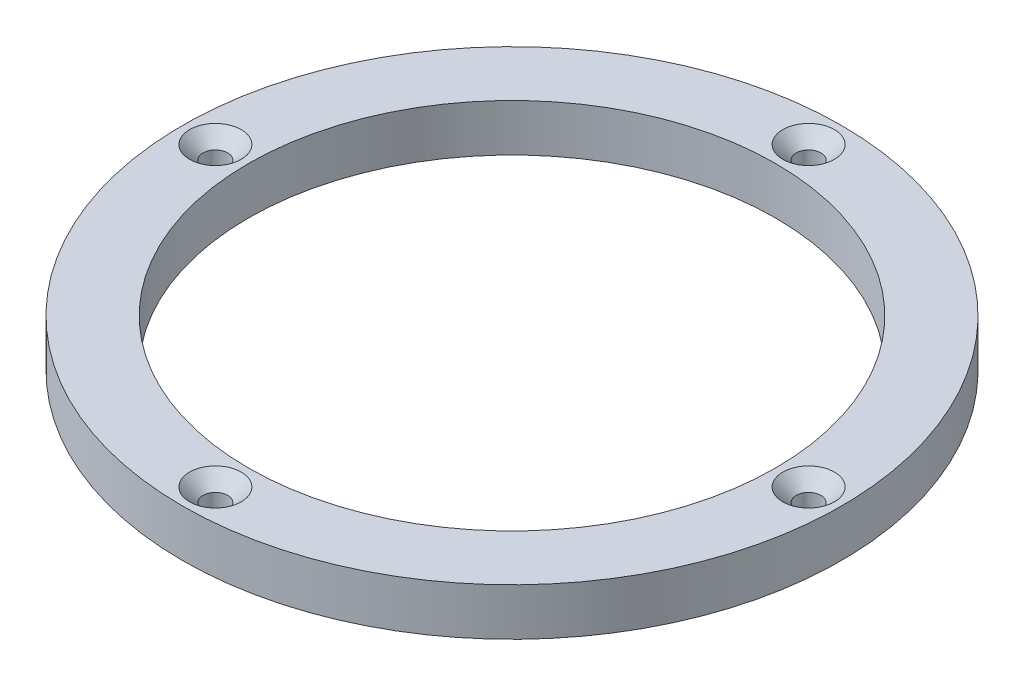
ISO-10303-21;
HEADER;
FILE_DESCRIPTION(('STEP AP214'),'2;1');
FILE_NAME('part.step','',(''),(''),'','','');
FILE_SCHEMA(('AUTOMOTIVE_DESIGN { 1 0 10303 214 1 1 1 1 }'));
ENDSEC;
DATA;
#1=APPLICATION_CONTEXT('core data for automotive mechanical design processes');
#2=APPLICATION_PROTOCOL_DEFINITION('international standard','automotive_design',2000,#1);
#3=PRODUCT_CONTEXT('',#1,'mechanical');
#4=PRODUCT('Part','Part','',(#3));
#5=PRODUCT_RELATED_PRODUCT_CATEGORY('part','',(#4));
#6=PRODUCT_DEFINITION_FORMATION('','',#4);
#7=PRODUCT_DEFINITION_CONTEXT('part definition',#1,'design');
#8=PRODUCT_DEFINITION('design','',#6,#7);
#9=PRODUCT_DEFINITION_SHAPE('','',#8);
#10=(LENGTH_UNIT() NAMED_UNIT(*) SI_UNIT(.MILLI.,.METRE.));
#11=(NAMED_UNIT(*) PLANE_ANGLE_UNIT() SI_UNIT($,.RADIAN.));
#12=(NAMED_UNIT(*) SI_UNIT($,.STERADIAN.) SOLID_ANGLE_UNIT());
#13=UNCERTAINTY_MEASURE_WITH_UNIT(LENGTH_MEASURE(1.E-05),#10,'distance_accuracy_value','');
#14=(GEOMETRIC_REPRESENTATION_CONTEXT(3) GLOBAL_UNCERTAINTY_ASSIGNED_CONTEXT((#13)) GLOBAL_UNIT_ASSIGNED_CONTEXT((#10,
#11,#12)) REPRESENTATION_CONTEXT('',''));
#15=CARTESIAN_POINT('',(0.,0.,0.));
#16=DIRECTION('',(0.,0.,1.));
#17=DIRECTION('',(1.,0.,0.));
#18=AXIS2_PLACEMENT_3D('',#15,#16,#17);
#19=CARTESIAN_POINT('',(0.,8.6,0.));
#20=DIRECTION('',(0.,1.,0.));
#21=DIRECTION('',(0.,0.,1.));
#22=AXIS2_PLACEMENT_3D('',#19,#20,#21);
#23=PLANE('',#22);
#24=CARTESIAN_POINT('',(0.,8.6,-54.));
#25=DIRECTION('',(0.,1.,0.));
#26=DIRECTION('',(0.,0.,1.));
#27=AXIS2_PLACEMENT_3D('',#24,#25,#26);
#28=CIRCLE('',#27,4.7);
#29=CARTESIAN_POINT('',(0.,8.6,-49.3));
#30=VERTEX_POINT('',#29);
#31=EDGE_CURVE('E86',#30,#30,#28,.T.);
#32=ORIENTED_EDGE('',*,*,#31,.F.);
#33=EDGE_LOOP('',(#32));
#34=FACE_BOUND('',#33,.T.);
#35=CARTESIAN_POINT('',(0.,8.6,54.));
#36=DIRECTION('',(0.,1.,0.));
#37=DIRECTION('',(0.,0.,1.));
#38=AXIS2_PLACEMENT_3D('',#35,#36,#37);
#39=CIRCLE('',#38,4.7);
#40=CARTESIAN_POINT('',(0.,8.6,58.7));
#41=VERTEX_POINT('',#40);
#42=EDGE_CURVE('E76',#41,#41,#39,.T.);
#43=ORIENTED_EDGE('',*,*,#42,.F.);
#44=EDGE_LOOP('',(#43));
#45=FACE_BOUND('',#44,.T.);
#46=CARTESIAN_POINT('',(-54.,8.6,0.));
#47=DIRECTION('',(0.,1.,0.));
#48=DIRECTION('',(0.,0.,1.));
#49=AXIS2_PLACEMENT_3D('',#46,#47,#48);
#50=CIRCLE('',#49,4.7);
#51=CARTESIAN_POINT('',(-54.,8.6,4.7));
#52=VERTEX_POINT('',#51);
#53=EDGE_CURVE('E66',#52,#52,#50,.T.);
#54=ORIENTED_EDGE('',*,*,#53,.F.);
#55=EDGE_LOOP('',(#54));
#56=FACE_BOUND('',#55,.T.);
#57=CARTESIAN_POINT('',(54.,8.6,0.));
#58=DIRECTION('',(0.,1.,0.));
#59=DIRECTION('',(0.,0.,1.));
#60=AXIS2_PLACEMENT_3D('',#57,#58,#59);
#61=CIRCLE('',#60,4.7);
#62=CARTESIAN_POINT('',(54.,8.6,4.7));
#63=VERTEX_POINT('',#62);
#64=EDGE_CURVE('E62',#63,#63,#61,.T.);
#65=ORIENTED_EDGE('',*,*,#64,.F.);
#66=EDGE_LOOP('',(#65));
#67=FACE_BOUND('',#66,.T.);
#68=CARTESIAN_POINT('',(0.,8.6,0.));
#69=DIRECTION('',(0.,1.,0.));
#70=DIRECTION('',(0.,0.,1.));
#71=AXIS2_PLACEMENT_3D('',#68,#69,#70);
#72=CIRCLE('',#71,60.);
#73=CARTESIAN_POINT('',(0.,8.6,-60.));
#74=VERTEX_POINT('',#73);
#75=EDGE_CURVE('E10',#74,#74,#72,.T.);
#76=ORIENTED_EDGE('',*,*,#75,.T.);
#77=EDGE_LOOP('',(#76));
#78=FACE_BOUND('',#77,.T.);
#79=CARTESIAN_POINT('',(0.,8.6,0.));
#80=DIRECTION('',(0.,1.,0.));
#81=DIRECTION('',(0.,0.,1.));
#82=AXIS2_PLACEMENT_3D('',#79,#80,#81);
#83=CIRCLE('',#82,48.);
#84=CARTESIAN_POINT('',(0.,8.6,-48.));
#85=VERTEX_POINT('',#84);
#86=EDGE_CURVE('E48',#85,#85,#83,.T.);
#87=ORIENTED_EDGE('',*,*,#86,.F.);
#88=EDGE_LOOP('',(#87));
#89=FACE_BOUND('',#88,.T.);
#90=ADVANCED_FACE('F40',(#34,#45,#56,#67,#78,#89),#23,.T.);
#91=CARTESIAN_POINT('',(0.,0.,0.));
#92=DIRECTION('',(0.,1.,0.));
#93=DIRECTION('',(0.,0.,1.));
#94=AXIS2_PLACEMENT_3D('',#91,#92,#93);
#95=PLANE('',#94);
#96=CARTESIAN_POINT('',(0.,0.,-54.));
#97=DIRECTION('',(0.,1.,0.));
#98=DIRECTION('',(0.,0.,1.));
#99=AXIS2_PLACEMENT_3D('',#96,#97,#98);
#100=CIRCLE('',#99,2.25);
#101=CARTESIAN_POINT('',(0.,0.,-51.75));
#102=VERTEX_POINT('',#101);
#103=EDGE_CURVE('E84',#102,#102,#100,.T.);
#104=ORIENTED_EDGE('',*,*,#103,.T.);
#105=EDGE_LOOP('',(#104));
#106=FACE_BOUND('',#105,.T.);
#107=CARTESIAN_POINT('',(0.,0.,54.));
#108=DIRECTION('',(0.,1.,0.));
#109=DIRECTION('',(0.,0.,1.));
#110=AXIS2_PLACEMENT_3D('',#107,#108,#109);
#111=CIRCLE('',#110,2.25);
#112=CARTESIAN_POINT('',(0.,0.,56.25));
#113=VERTEX_POINT('',#112);
#114=EDGE_CURVE('E71',#113,#113,#111,.T.);
#115=ORIENTED_EDGE('',*,*,#114,.T.);
#116=EDGE_LOOP('',(#115));
#117=FACE_BOUND('',#116,.T.);
#118=CARTESIAN_POINT('',(-54.,0.,0.));
#119=DIRECTION('',(0.,1.,0.));
#120=DIRECTION('',(0.,0.,1.));
#121=AXIS2_PLACEMENT_3D('',#118,#119,#120);
#122=CIRCLE('',#121,2.25);
#123=CARTESIAN_POINT('',(-54.,0.,2.25));
#124=VERTEX_POINT('',#123);
#125=EDGE_CURVE('E61',#124,#124,#122,.T.);
#126=ORIENTED_EDGE('',*,*,#125,.T.);
#127=EDGE_LOOP('',(#126));
#128=FACE_BOUND('',#127,.T.);
#129=CARTESIAN_POINT('',(54.,0.,0.));
#130=DIRECTION('',(0.,1.,0.));
#131=DIRECTION('',(0.,0.,1.));
#132=AXIS2_PLACEMENT_3D('',#129,#130,#131);
#133=CIRCLE('',#132,2.25);
#134=CARTESIAN_POINT('',(54.,0.,2.25));
#135=VERTEX_POINT('',#134);
#136=EDGE_CURVE('E52',#135,#135,#133,.T.);
#137=ORIENTED_EDGE('',*,*,#136,.T.);
#138=EDGE_LOOP('',(#137));
#139=FACE_BOUND('',#138,.T.);
#140=CARTESIAN_POINT('',(0.,0.,0.));
#141=DIRECTION('',(0.,1.,0.));
#142=DIRECTION('',(0.,0.,1.));
#143=AXIS2_PLACEMENT_3D('',#140,#141,#142);
#144=CIRCLE('',#143,60.);
#145=CARTESIAN_POINT('',(0.,0.,-60.));
#146=VERTEX_POINT('',#145);
#147=EDGE_CURVE('E41',#146,#146,#144,.T.);
#148=ORIENTED_EDGE('',*,*,#147,.F.);
#149=EDGE_LOOP('',(#148));
#150=FACE_BOUND('',#149,.T.);
#151=CARTESIAN_POINT('',(0.,0.,0.));
#152=DIRECTION('',(0.,1.,0.));
#153=DIRECTION('',(0.,0.,1.));
#154=AXIS2_PLACEMENT_3D('',#151,#152,#153);
#155=CIRCLE('',#154,48.);
#156=CARTESIAN_POINT('',(0.,0.,-48.));
#157=VERTEX_POINT('',#156);
#158=EDGE_CURVE('E49',#157,#157,#155,.T.);
#159=ORIENTED_EDGE('',*,*,#158,.T.);
#160=EDGE_LOOP('',(#159));
#161=FACE_BOUND('',#160,.T.);
#162=ADVANCED_FACE('F96',(#106,#117,#128,#139,#150,#161),#95,.F.);
#163=CARTESIAN_POINT('',(0.,8.6,0.));
#164=DIRECTION('',(0.,-1.,0.));
#165=DIRECTION('',(0.,0.,-1.));
#166=AXIS2_PLACEMENT_3D('',#163,#164,#165);
#167=CYLINDRICAL_SURFACE('',#166,60.);
#168=CARTESIAN_POINT('',(0.,8.6,-60.));
#169=CARTESIAN_POINT('',(0.,8.51041666666666,-60.));
#170=CARTESIAN_POINT('',(0.,8.42083333333333,-60.));
#171=CARTESIAN_POINT('',(0.,8.24166666666667,-60.));
#172=CARTESIAN_POINT('',(0.,8.15208333333333,-60.));
#173=CARTESIAN_POINT('',(0.,7.97291666666667,-60.));
#174=CARTESIAN_POINT('',(0.,7.88333333333333,-60.));
#175=CARTESIAN_POINT('',(0.,7.70416666666667,-60.));
#176=CARTESIAN_POINT('',(0.,7.61458333333333,-60.));
#177=CARTESIAN_POINT('',(0.,7.43541666666667,-60.));
#178=CARTESIAN_POINT('',(0.,7.34583333333333,-60.));
#179=CARTESIAN_POINT('',(0.,7.16666666666667,-60.));
#180=CARTESIAN_POINT('',(0.,7.07708333333333,-60.));
#181=CARTESIAN_POINT('',(0.,6.89791666666667,-60.));
#182=CARTESIAN_POINT('',(0.,6.80833333333333,-60.));
#183=CARTESIAN_POINT('',(0.,6.62916666666667,-60.));
#184=CARTESIAN_POINT('',(0.,6.53958333333333,-60.));
#185=CARTESIAN_POINT('',(0.,6.36041666666667,-60.));
#186=CARTESIAN_POINT('',(0.,6.27083333333333,-60.));
#187=CARTESIAN_POINT('',(0.,6.09166666666667,-60.));
#188=CARTESIAN_POINT('',(0.,6.00208333333333,-60.));
#189=CARTESIAN_POINT('',(0.,5.82291666666667,-60.));
#190=CARTESIAN_POINT('',(0.,5.73333333333333,-60.));
#191=CARTESIAN_POINT('',(0.,5.55416666666667,-60.));
#192=CARTESIAN_POINT('',(0.,5.46458333333333,-60.));
#193=CARTESIAN_POINT('',(0.,5.28541666666667,-60.));
#194=CARTESIAN_POINT('',(0.,5.19583333333333,-60.));
#195=CARTESIAN_POINT('',(0.,5.01666666666667,-60.));
#196=CARTESIAN_POINT('',(0.,4.92708333333333,-60.));
#197=CARTESIAN_POINT('',(0.,4.74791666666667,-60.));
#198=CARTESIAN_POINT('',(0.,4.65833333333333,-60.));
#199=CARTESIAN_POINT('',(0.,4.47916666666667,-60.));
#200=CARTESIAN_POINT('',(0.,4.38958333333333,-60.));
#201=CARTESIAN_POINT('',(0.,4.21041666666667,-60.));
#202=CARTESIAN_POINT('',(0.,4.12083333333333,-60.));
#203=CARTESIAN_POINT('',(0.,3.94166666666667,-60.));
#204=CARTESIAN_POINT('',(0.,3.85208333333333,-60.));
#205=CARTESIAN_POINT('',(0.,3.67291666666667,-60.));
#206=CARTESIAN_POINT('',(0.,3.58333333333333,-60.));
#207=CARTESIAN_POINT('',(0.,3.40416666666667,-60.));
#208=CARTESIAN_POINT('',(0.,3.31458333333333,-60.));
#209=CARTESIAN_POINT('',(0.,3.13541666666667,-60.));
#210=CARTESIAN_POINT('',(0.,3.04583333333333,-60.));
#211=CARTESIAN_POINT('',(0.,2.86666666666667,-60.));
#212=CARTESIAN_POINT('',(0.,2.77708333333333,-60.));
#213=CARTESIAN_POINT('',(0.,2.59791666666667,-60.));
#214=CARTESIAN_POINT('',(0.,2.50833333333333,-60.));
#215=CARTESIAN_POINT('',(0.,2.32916666666667,-60.));
#216=CARTESIAN_POINT('',(0.,2.23958333333333,-60.));
#217=CARTESIAN_POINT('',(0.,2.06041666666667,-60.));
#218=CARTESIAN_POINT('',(0.,1.97083333333333,-60.));
#219=CARTESIAN_POINT('',(0.,1.79166666666667,-60.));
#220=CARTESIAN_POINT('',(0.,1.70208333333333,-60.));
#221=CARTESIAN_POINT('',(0.,1.52291666666667,-60.));
#222=CARTESIAN_POINT('',(0.,1.43333333333333,-60.));
#223=CARTESIAN_POINT('',(0.,1.25416666666667,-60.));
#224=CARTESIAN_POINT('',(0.,1.16458333333333,-60.));
#225=CARTESIAN_POINT('',(0.,0.985416666666665,-60.));
#226=CARTESIAN_POINT('',(0.,0.895833333333332,-60.));
#227=CARTESIAN_POINT('',(0.,0.716666666666665,-60.));
#228=CARTESIAN_POINT('',(0.,0.627083333333332,-60.));
#229=CARTESIAN_POINT('',(0.,0.447916666666665,-60.));
#230=CARTESIAN_POINT('',(0.,0.358333333333331,-60.));
#231=CARTESIAN_POINT('',(0.,0.179166666666665,-60.));
#232=CARTESIAN_POINT('',(0.,0.0895833333333315,-60.));
#233=CARTESIAN_POINT('',(0.,0.,-60.));
#234=B_SPLINE_CURVE_WITH_KNOTS('',3,(#168,#169,#170,#171,#172,#173,#174,#175,#176,#177,#178,
#179,#180,#181,#182,#183,#184,#185,#186,#187,#188,#189,#190,#191,#192,#193,#194,#195,#196,#197,
#198,#199,#200,#201,#202,#203,#204,#205,#206,#207,#208,#209,#210,#211,#212,#213,#214,#215,#216,
#217,#218,#219,#220,#221,#222,#223,#224,#225,#226,#227,#228,#229,#230,#231,#232,#233),
.UNSPECIFIED.,.F.,.F.,(4,2,2,2,2,2,2,2,2,2,2,2,2,2,2,2,2,2,2,2,2,2,2,2,2,2,2,2,2,2,2,2,4),(0.,
0.26875,0.5375,0.806249999999999,1.075,1.34375,1.6125,1.88125,2.15,2.41875,2.6875,2.95625,3.225,
3.49375,3.7625,4.03125,4.3,4.56875,4.8375,5.10625,5.375,5.64375,5.9125,6.18125,6.45,6.71875,
6.9875,7.25625,7.525,7.79375,8.0625,8.33125,8.6),.UNSPECIFIED.);
#235=EDGE_CURVE('BSEAM39',#74,#146,#234,.T.);
#236=ORIENTED_EDGE('',*,*,#75,.F.);
#237=ORIENTED_EDGE('',*,*,#147,.T.);
#238=ORIENTED_EDGE('',*,*,#235,.T.);
#239=ORIENTED_EDGE('',*,*,#235,.F.);
#240=EDGE_LOOP('',(#236,#238,#237,#239));
#241=FACE_BOUND('',#240,.T.);
#242=ADVANCED_FACE('F39',(#241),#167,.T.);
#243=CARTESIAN_POINT('',(0.,8.6,0.));
#244=DIRECTION('',(0.,-1.,0.));
#245=DIRECTION('',(0.,0.,-1.));
#246=AXIS2_PLACEMENT_3D('',#243,#244,#245);
#247=CYLINDRICAL_SURFACE('',#246,48.);
#248=CARTESIAN_POINT('',(0.,8.6,-48.));
#249=CARTESIAN_POINT('',(0.,8.51041666666666,-48.));
#250=CARTESIAN_POINT('',(0.,8.42083333333333,-48.));
#251=CARTESIAN_POINT('',(0.,8.24166666666667,-48.));
#252=CARTESIAN_POINT('',(0.,8.15208333333333,-48.));
#253=CARTESIAN_POINT('',(0.,7.97291666666667,-48.));
#254=CARTESIAN_POINT('',(0.,7.88333333333333,-48.));
#255=CARTESIAN_POINT('',(0.,7.70416666666667,-48.));
#256=CARTESIAN_POINT('',(0.,7.61458333333333,-48.));
#257=CARTESIAN_POINT('',(0.,7.43541666666667,-48.));
#258=CARTESIAN_POINT('',(0.,7.34583333333333,-48.));
#259=CARTESIAN_POINT('',(0.,7.16666666666667,-48.));
#260=CARTESIAN_POINT('',(0.,7.07708333333333,-48.));
#261=CARTESIAN_POINT('',(0.,6.89791666666667,-48.));
#262=CARTESIAN_POINT('',(0.,6.80833333333333,-48.));
#263=CARTESIAN_POINT('',(0.,6.62916666666667,-48.));
#264=CARTESIAN_POINT('',(0.,6.53958333333333,-48.));
#265=CARTESIAN_POINT('',(0.,6.36041666666667,-48.));
#266=CARTESIAN_POINT('',(0.,6.27083333333333,-48.));
#267=CARTESIAN_POINT('',(0.,6.09166666666667,-48.));
#268=CARTESIAN_POINT('',(0.,6.00208333333333,-48.));
#269=CARTESIAN_POINT('',(0.,5.82291666666667,-48.));
#270=CARTESIAN_POINT('',(0.,5.73333333333333,-48.));
#271=CARTESIAN_POINT('',(0.,5.55416666666667,-48.));
#272=CARTESIAN_POINT('',(0.,5.46458333333333,-48.));
#273=CARTESIAN_POINT('',(0.,5.28541666666667,-48.));
#274=CARTESIAN_POINT('',(0.,5.19583333333333,-48.));
#275=CARTESIAN_POINT('',(0.,5.01666666666667,-48.));
#276=CARTESIAN_POINT('',(0.,4.92708333333333,-48.));
#277=CARTESIAN_POINT('',(0.,4.74791666666667,-48.));
#278=CARTESIAN_POINT('',(0.,4.65833333333333,-48.));
#279=CARTESIAN_POINT('',(0.,4.47916666666667,-48.));
#280=CARTESIAN_POINT('',(0.,4.38958333333333,-48.));
#281=CARTESIAN_POINT('',(0.,4.21041666666667,-48.));
#282=CARTESIAN_POINT('',(0.,4.12083333333333,-48.));
#283=CARTESIAN_POINT('',(0.,3.94166666666667,-48.));
#284=CARTESIAN_POINT('',(0.,3.85208333333333,-48.));
#285=CARTESIAN_POINT('',(0.,3.67291666666667,-48.));
#286=CARTESIAN_POINT('',(0.,3.58333333333333,-48.));
#287=CARTESIAN_POINT('',(0.,3.40416666666667,-48.));
#288=CARTESIAN_POINT('',(0.,3.31458333333333,-48.));
#289=CARTESIAN_POINT('',(0.,3.13541666666667,-48.));
#290=CARTESIAN_POINT('',(0.,3.04583333333333,-48.));
#291=CARTESIAN_POINT('',(0.,2.86666666666667,-48.));
#292=CARTESIAN_POINT('',(0.,2.77708333333333,-48.));
#293=CARTESIAN_POINT('',(0.,2.59791666666667,-48.));
#294=CARTESIAN_POINT('',(0.,2.50833333333333,-48.));
#295=CARTESIAN_POINT('',(0.,2.32916666666667,-48.));
#296=CARTESIAN_POINT('',(0.,2.23958333333333,-48.));
#297=CARTESIAN_POINT('',(0.,2.06041666666667,-48.));
#298=CARTESIAN_POINT('',(0.,1.97083333333333,-48.));
#299=CARTESIAN_POINT('',(0.,1.79166666666667,-48.));
#300=CARTESIAN_POINT('',(0.,1.70208333333333,-48.));
#301=CARTESIAN_POINT('',(0.,1.52291666666667,-48.));
#302=CARTESIAN_POINT('',(0.,1.43333333333333,-48.));
#303=CARTESIAN_POINT('',(0.,1.25416666666667,-48.));
#304=CARTESIAN_POINT('',(0.,1.16458333333333,-48.));
#305=CARTESIAN_POINT('',(0.,0.985416666666665,-48.));
#306=CARTESIAN_POINT('',(0.,0.895833333333332,-48.));
#307=CARTESIAN_POINT('',(0.,0.716666666666665,-48.));
#308=CARTESIAN_POINT('',(0.,0.627083333333332,-48.));
#309=CARTESIAN_POINT('',(0.,0.447916666666665,-48.));
#310=CARTESIAN_POINT('',(0.,0.358333333333331,-48.));
#311=CARTESIAN_POINT('',(0.,0.179166666666665,-48.));
#312=CARTESIAN_POINT('',(0.,0.0895833333333315,-48.));
#313=CARTESIAN_POINT('',(0.,0.,-48.));
#314=B_SPLINE_CURVE_WITH_KNOTS('',3,(#248,#249,#250,#251,#252,#253,#254,#255,#256,#257,#258,
#259,#260,#261,#262,#263,#264,#265,#266,#267,#268,#269,#270,#271,#272,#273,#274,#275,#276,#277,
#278,#279,#280,#281,#282,#283,#284,#285,#286,#287,#288,#289,#290,#291,#292,#293,#294,#295,#296,
#297,#298,#299,#300,#301,#302,#303,#304,#305,#306,#307,#308,#309,#310,#311,#312,#313),
.UNSPECIFIED.,.F.,.F.,(4,2,2,2,2,2,2,2,2,2,2,2,2,2,2,2,2,2,2,2,2,2,2,2,2,2,2,2,2,2,2,2,4),(0.,
0.26875,0.5375,0.806249999999999,1.075,1.34375,1.6125,1.88125,2.15,2.41875,2.6875,2.95625,3.225,
3.49375,3.7625,4.03125,4.3,4.56875,4.8375,5.10625,5.375,5.64375,5.9125,6.18125,6.45,6.71875,
6.9875,7.25625,7.525,7.79375,8.0625,8.33125,8.6),.UNSPECIFIED.);
#315=EDGE_CURVE('BSEAM106',#85,#157,#314,.T.);
#316=ORIENTED_EDGE('',*,*,#86,.T.);
#317=ORIENTED_EDGE('',*,*,#158,.F.);
#318=ORIENTED_EDGE('',*,*,#315,.T.);
#319=ORIENTED_EDGE('',*,*,#315,.F.);
#320=EDGE_LOOP('',(#316,#318,#317,#319));
#321=FACE_BOUND('',#320,.T.);
#322=ADVANCED_FACE('F106',(#321),#247,.F.);
#323=CARTESIAN_POINT('',(54.,8.6,0.));
#324=DIRECTION('',(0.,1.,0.));
#325=DIRECTION('',(0.,0.,1.));
#326=AXIS2_PLACEMENT_3D('',#323,#324,#325);
#327=CYLINDRICAL_SURFACE('',#326,2.25);
#328=ORIENTED_EDGE('',*,*,#136,.F.);
#329=EDGE_LOOP('',(#328));
#330=FACE_BOUND('',#329,.T.);
#331=CARTESIAN_POINT('',(54.,6.15,0.));
#332=DIRECTION('',(0.,1.,0.));
#333=DIRECTION('',(0.,0.,1.));
#334=AXIS2_PLACEMENT_3D('',#331,#332,#333);
#335=CIRCLE('',#334,2.25);
#336=CARTESIAN_POINT('',(54.,6.15,2.25));
#337=VERTEX_POINT('',#336);
#338=EDGE_CURVE('E59',#337,#337,#335,.T.);
#339=ORIENTED_EDGE('',*,*,#338,.T.);
#340=EDGE_LOOP('',(#339));
#341=FACE_BOUND('',#340,.T.);
#342=ADVANCED_FACE('F108',(#330,#341),#327,.F.);
#343=CARTESIAN_POINT('',(54.,8.6,0.));
#344=DIRECTION('',(0.,1.,0.));
#345=DIRECTION('',(0.,0.,1.));
#346=AXIS2_PLACEMENT_3D('',#343,#344,#345);
#347=CONICAL_SURFACE('',#346,4.7,0.785398163397447);
#348=ORIENTED_EDGE('',*,*,#338,.F.);
#349=EDGE_LOOP('',(#348));
#350=FACE_BOUND('',#349,.T.);
#351=ORIENTED_EDGE('',*,*,#64,.T.);
#352=EDGE_LOOP('',(#351));
#353=FACE_BOUND('',#352,.T.);
#354=ADVANCED_FACE('F122',(#350,#353),#347,.F.);
#355=CARTESIAN_POINT('',(-54.,8.6,0.));
#356=DIRECTION('',(0.,1.,0.));
#357=DIRECTION('',(0.,0.,1.));
#358=AXIS2_PLACEMENT_3D('',#355,#356,#357);
#359=CYLINDRICAL_SURFACE('',#358,2.25);
#360=ORIENTED_EDGE('',*,*,#125,.F.);
#361=EDGE_LOOP('',(#360));
#362=FACE_BOUND('',#361,.T.);
#363=CARTESIAN_POINT('',(-54.,6.15,0.));
#364=DIRECTION('',(0.,1.,0.));
#365=DIRECTION('',(0.,0.,1.));
#366=AXIS2_PLACEMENT_3D('',#363,#364,#365);
#367=CIRCLE('',#366,2.25);
#368=CARTESIAN_POINT('',(-54.,6.15,2.25));
#369=VERTEX_POINT('',#368);
#370=EDGE_CURVE('E69',#369,#369,#367,.T.);
#371=ORIENTED_EDGE('',*,*,#370,.T.);
#372=EDGE_LOOP('',(#371));
#373=FACE_BOUND('',#372,.T.);
#374=ADVANCED_FACE('F130',(#362,#373),#359,.F.);
#375=CARTESIAN_POINT('',(-54.,8.6,0.));
#376=DIRECTION('',(0.,1.,0.));
#377=DIRECTION('',(0.,0.,1.));
#378=AXIS2_PLACEMENT_3D('',#375,#376,#377);
#379=CONICAL_SURFACE('',#378,4.7,0.785398163397447);
#380=ORIENTED_EDGE('',*,*,#370,.F.);
#381=EDGE_LOOP('',(#380));
#382=FACE_BOUND('',#381,.T.);
#383=ORIENTED_EDGE('',*,*,#53,.T.);
#384=EDGE_LOOP('',(#383));
#385=FACE_BOUND('',#384,.T.);
#386=ADVANCED_FACE('F132',(#382,#385),#379,.F.);
#387=CARTESIAN_POINT('',(0.,8.6,54.));
#388=DIRECTION('',(0.,1.,0.));
#389=DIRECTION('',(0.,0.,1.));
#390=AXIS2_PLACEMENT_3D('',#387,#388,#389);
#391=CYLINDRICAL_SURFACE('',#390,2.25);
#392=ORIENTED_EDGE('',*,*,#114,.F.);
#393=EDGE_LOOP('',(#392));
#394=FACE_BOUND('',#393,.T.);
#395=CARTESIAN_POINT('',(0.,6.15,54.));
#396=DIRECTION('',(0.,1.,0.));
#397=DIRECTION('',(0.,0.,1.));
#398=AXIS2_PLACEMENT_3D('',#395,#396,#397);
#399=CIRCLE('',#398,2.25);
#400=CARTESIAN_POINT('',(0.,6.15,56.25));
#401=VERTEX_POINT('',#400);
#402=EDGE_CURVE('E77',#401,#401,#399,.T.);
#403=ORIENTED_EDGE('',*,*,#402,.T.);
#404=EDGE_LOOP('',(#403));
#405=FACE_BOUND('',#404,.T.);
#406=ADVANCED_FACE('F133',(#394,#405),#391,.F.);
#407=CARTESIAN_POINT('',(0.,8.6,54.));
#408=DIRECTION('',(0.,1.,0.));
#409=DIRECTION('',(0.,0.,1.));
#410=AXIS2_PLACEMENT_3D('',#407,#408,#409);
#411=CONICAL_SURFACE('',#410,4.7,0.785398163397448);
#412=ORIENTED_EDGE('',*,*,#402,.F.);
#413=EDGE_LOOP('',(#412));
#414=FACE_BOUND('',#413,.T.);
#415=ORIENTED_EDGE('',*,*,#42,.T.);
#416=EDGE_LOOP('',(#415));
#417=FACE_BOUND('',#416,.T.);
#418=ADVANCED_FACE('F140',(#414,#417),#411,.F.);
#419=CARTESIAN_POINT('',(0.,8.6,-54.));
#420=DIRECTION('',(0.,1.,0.));
#421=DIRECTION('',(0.,0.,1.));
#422=AXIS2_PLACEMENT_3D('',#419,#420,#421);
#423=CYLINDRICAL_SURFACE('',#422,2.25);
#424=ORIENTED_EDGE('',*,*,#103,.F.);
#425=EDGE_LOOP('',(#424));
#426=FACE_BOUND('',#425,.T.);
#427=CARTESIAN_POINT('',(0.,6.15,-54.));
#428=DIRECTION('',(0.,1.,0.));
#429=DIRECTION('',(0.,0.,1.));
#430=AXIS2_PLACEMENT_3D('',#427,#428,#429);
#431=CIRCLE('',#430,2.25);
#432=CARTESIAN_POINT('',(0.,6.15,-51.75));
#433=VERTEX_POINT('',#432);
#434=EDGE_CURVE('E81',#433,#433,#431,.T.);
#435=ORIENTED_EDGE('',*,*,#434,.T.);
#436=EDGE_LOOP('',(#435));
#437=FACE_BOUND('',#436,.T.);
#438=ADVANCED_FACE('F141',(#426,#437),#423,.F.);
#439=CARTESIAN_POINT('',(0.,8.6,-54.));
#440=DIRECTION('',(0.,1.,0.));
#441=DIRECTION('',(0.,0.,1.));
#442=AXIS2_PLACEMENT_3D('',#439,#440,#441);
#443=CONICAL_SURFACE('',#442,4.7,0.785398163397448);
#444=ORIENTED_EDGE('',*,*,#434,.F.);
#445=EDGE_LOOP('',(#444));
#446=FACE_BOUND('',#445,.T.);
#447=ORIENTED_EDGE('',*,*,#31,.T.);
#448=EDGE_LOOP('',(#447));
#449=FACE_BOUND('',#448,.T.);
#450=ADVANCED_FACE('F95',(#446,#449),#443,.F.);
#451=CLOSED_SHELL('',(#90,#162,#242,#322,#342,#354,#374,#386,#406,#418,#438,#450));
#452=MANIFOLD_SOLID_BREP('B2',#451);
#453=ADVANCED_BREP_SHAPE_REPRESENTATION('',(#18,#452),#14);
#454=SHAPE_DEFINITION_REPRESENTATION(#9,#453);
ENDSEC;
END-ISO-10303-21;
